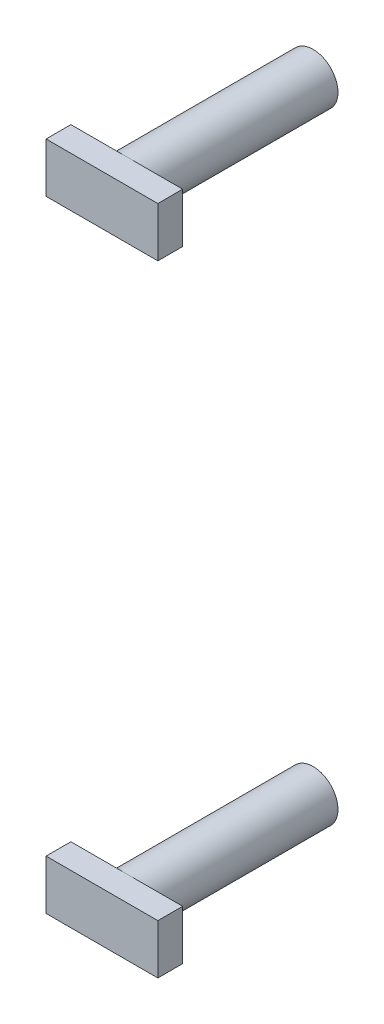
ISO-10303-21;
HEADER;
FILE_DESCRIPTION(('STEP AP214'),'2;1');
FILE_NAME('part.step','',(''),(''),'','','');
FILE_SCHEMA(('AUTOMOTIVE_DESIGN { 1 0 10303 214 1 1 1 1 }'));
ENDSEC;
DATA;
#1=APPLICATION_CONTEXT('core data for automotive mechanical design processes');
#2=APPLICATION_PROTOCOL_DEFINITION('international standard','automotive_design',2000,#1);
#3=PRODUCT_CONTEXT('',#1,'mechanical');
#4=PRODUCT('Part','Part','',(#3));
#5=PRODUCT_RELATED_PRODUCT_CATEGORY('part','',(#4));
#6=PRODUCT_DEFINITION_FORMATION('','',#4);
#7=PRODUCT_DEFINITION_CONTEXT('part definition',#1,'design');
#8=PRODUCT_DEFINITION('design','',#6,#7);
#9=PRODUCT_DEFINITION_SHAPE('','',#8);
#10=(LENGTH_UNIT() NAMED_UNIT(*) SI_UNIT(.MILLI.,.METRE.));
#11=(NAMED_UNIT(*) PLANE_ANGLE_UNIT() SI_UNIT($,.RADIAN.));
#12=(NAMED_UNIT(*) SI_UNIT($,.STERADIAN.) SOLID_ANGLE_UNIT());
#13=UNCERTAINTY_MEASURE_WITH_UNIT(LENGTH_MEASURE(1.E-05),#10,'distance_accuracy_value','');
#14=(GEOMETRIC_REPRESENTATION_CONTEXT(3) GLOBAL_UNCERTAINTY_ASSIGNED_CONTEXT((#13)) GLOBAL_UNIT_ASSIGNED_CONTEXT((#10,
#11,#12)) REPRESENTATION_CONTEXT('',''));
#15=CARTESIAN_POINT('',(0.,0.,0.));
#16=DIRECTION('',(0.,0.,1.));
#17=DIRECTION('',(1.,0.,0.));
#18=AXIS2_PLACEMENT_3D('',#15,#16,#17);
#19=CARTESIAN_POINT('',(19.,25.,-15.));
#20=DIRECTION('',(0.,0.,1.));
#21=DIRECTION('',(1.,0.,0.));
#22=AXIS2_PLACEMENT_3D('',#19,#20,#21);
#23=CYLINDRICAL_SURFACE('',#22,2.00000000000001);
#24=CARTESIAN_POINT('',(19.,25.,-15.));
#25=DIRECTION('',(0.,0.,1.));
#26=DIRECTION('',(1.,0.,0.));
#27=AXIS2_PLACEMENT_3D('',#24,#25,#26);
#28=CIRCLE('',#27,2.00000000000001);
#29=CARTESIAN_POINT('',(21.,25.,-15.));
#30=VERTEX_POINT('',#29);
#31=EDGE_CURVE('E13',#30,#30,#28,.T.);
#32=ORIENTED_EDGE('',*,*,#31,.T.);
#33=EDGE_LOOP('',(#32));
#34=FACE_BOUND('',#33,.T.);
#35=CARTESIAN_POINT('',(19.,25.,0.));
#36=DIRECTION('',(0.,0.,1.));
#37=DIRECTION('',(1.,0.,0.));
#38=AXIS2_PLACEMENT_3D('',#35,#36,#37);
#39=CIRCLE('',#38,2.00000000000001);
#40=CARTESIAN_POINT('',(19.,27.,0.));
#41=VERTEX_POINT('',#40);
#42=CARTESIAN_POINT('',(19.,23.,0.));
#43=VERTEX_POINT('',#42);
#44=EDGE_CURVE('E84',#41,#43,#39,.T.);
#45=ORIENTED_EDGE('',*,*,#44,.F.);
#46=EDGE_CURVE('E94',#43,#41,#39,.T.);
#47=ORIENTED_EDGE('',*,*,#46,.F.);
#48=EDGE_LOOP('',(#45,#47));
#49=FACE_BOUND('',#48,.T.);
#50=ADVANCED_FACE('F81',(#34,#49),#23,.T.);
#51=CARTESIAN_POINT('',(0.,0.,-15.));
#52=DIRECTION('',(0.,0.,1.));
#53=DIRECTION('',(1.,0.,0.));
#54=AXIS2_PLACEMENT_3D('',#51,#52,#53);
#55=PLANE('',#54);
#56=ORIENTED_EDGE('',*,*,#31,.F.);
#57=EDGE_LOOP('',(#56));
#58=FACE_BOUND('',#57,.T.);
#59=ADVANCED_FACE('F187',(#58),#55,.F.);
#60=CARTESIAN_POINT('',(19.,25.,0.));
#61=DIRECTION('',(0.,0.,1.));
#62=DIRECTION('',(1.,0.,0.));
#63=AXIS2_PLACEMENT_3D('',#60,#61,#62);
#64=PLANE('',#63);
#65=DIRECTION('',(1.,0.,0.));
#66=VECTOR('',#65,1.);
#67=CARTESIAN_POINT('',(14.5,27.,0.));
#68=LINE('',#67,#66);
#69=CARTESIAN_POINT('',(14.5,27.,0.));
#70=VERTEX_POINT('',#69);
#71=EDGE_CURVE('E143',#70,#41,#68,.T.);
#72=ORIENTED_EDGE('',*,*,#71,.T.);
#73=ORIENTED_EDGE('',*,*,#44,.T.);
#74=DIRECTION('',(1.,0.,0.));
#75=VECTOR('',#74,1.);
#76=CARTESIAN_POINT('',(14.5,23.,0.));
#77=LINE('',#76,#75);
#78=CARTESIAN_POINT('',(14.5,23.,0.));
#79=VERTEX_POINT('',#78);
#80=EDGE_CURVE('E162',#79,#43,#77,.T.);
#81=ORIENTED_EDGE('',*,*,#80,.F.);
#82=DIRECTION('',(0.,-1.,0.));
#83=VECTOR('',#82,1.);
#84=CARTESIAN_POINT('',(14.5,27.,0.));
#85=LINE('',#84,#83);
#86=EDGE_CURVE('E147',#70,#79,#85,.T.);
#87=ORIENTED_EDGE('',*,*,#86,.F.);
#88=EDGE_LOOP('',(#72,#73,#81,#87));
#89=FACE_BOUND('',#88,.T.);
#90=ADVANCED_FACE('F176',(#89),#64,.F.);
#91=CARTESIAN_POINT('',(23.5,23.,0.));
#92=VERTEX_POINT('',#91);
#93=EDGE_CURVE('E164',#43,#92,#77,.T.);
#94=ORIENTED_EDGE('',*,*,#93,.F.);
#95=ORIENTED_EDGE('',*,*,#46,.T.);
#96=CARTESIAN_POINT('',(23.5,27.,0.));
#97=VERTEX_POINT('',#96);
#98=EDGE_CURVE('E158',#41,#97,#68,.T.);
#99=ORIENTED_EDGE('',*,*,#98,.T.);
#100=DIRECTION('',(0.,-1.,0.));
#101=VECTOR('',#100,1.);
#102=CARTESIAN_POINT('',(23.5,27.,0.));
#103=LINE('',#102,#101);
#104=EDGE_CURVE('E159',#97,#92,#103,.T.);
#105=ORIENTED_EDGE('',*,*,#104,.T.);
#106=EDGE_LOOP('',(#94,#95,#99,#105));
#107=FACE_BOUND('',#106,.T.);
#108=ADVANCED_FACE('F179',(#107),#64,.F.);
#109=CARTESIAN_POINT('',(19.,25.,2.));
#110=DIRECTION('',(0.,0.,1.));
#111=DIRECTION('',(1.,0.,0.));
#112=AXIS2_PLACEMENT_3D('',#109,#110,#111);
#113=PLANE('',#112);
#114=DIRECTION('',(1.,0.,0.));
#115=VECTOR('',#114,1.);
#116=CARTESIAN_POINT('',(14.5,23.,2.));
#117=LINE('',#116,#115);
#118=CARTESIAN_POINT('',(14.5,23.,2.));
#119=VERTEX_POINT('',#118);
#120=CARTESIAN_POINT('',(23.5,23.,2.));
#121=VERTEX_POINT('',#120);
#122=EDGE_CURVE('E123',#119,#121,#117,.T.);
#123=ORIENTED_EDGE('',*,*,#122,.T.);
#124=DIRECTION('',(0.,-1.,0.));
#125=VECTOR('',#124,1.);
#126=CARTESIAN_POINT('',(23.5,27.,2.));
#127=LINE('',#126,#125);
#128=CARTESIAN_POINT('',(23.5,27.,2.));
#129=VERTEX_POINT('',#128);
#130=EDGE_CURVE('E135',#129,#121,#127,.T.);
#131=ORIENTED_EDGE('',*,*,#130,.F.);
#132=DIRECTION('',(1.,0.,0.));
#133=VECTOR('',#132,1.);
#134=CARTESIAN_POINT('',(14.5,27.,2.));
#135=LINE('',#134,#133);
#136=CARTESIAN_POINT('',(14.5,27.,2.));
#137=VERTEX_POINT('',#136);
#138=EDGE_CURVE('E141',#137,#129,#135,.T.);
#139=ORIENTED_EDGE('',*,*,#138,.F.);
#140=DIRECTION('',(0.,-1.,0.));
#141=VECTOR('',#140,1.);
#142=CARTESIAN_POINT('',(14.5,27.,2.));
#143=LINE('',#142,#141);
#144=EDGE_CURVE('E136',#137,#119,#143,.T.);
#145=ORIENTED_EDGE('',*,*,#144,.T.);
#146=EDGE_LOOP('',(#123,#131,#139,#145));
#147=FACE_BOUND('',#146,.T.);
#148=ADVANCED_FACE('F140',(#147),#113,.T.);
#149=CARTESIAN_POINT('',(23.5,27.,2.));
#150=DIRECTION('',(1.,0.,0.));
#151=DIRECTION('',(0.,0.,-1.));
#152=AXIS2_PLACEMENT_3D('',#149,#150,#151);
#153=PLANE('',#152);
#154=ORIENTED_EDGE('',*,*,#104,.F.);
#155=DIRECTION('',(0.,0.,-1.));
#156=VECTOR('',#155,1.);
#157=CARTESIAN_POINT('',(23.5,27.,2.));
#158=LINE('',#157,#156);
#159=EDGE_CURVE('E149',#129,#97,#158,.T.);
#160=ORIENTED_EDGE('',*,*,#159,.F.);
#161=ORIENTED_EDGE('',*,*,#130,.T.);
#162=DIRECTION('',(0.,0.,-1.));
#163=VECTOR('',#162,1.);
#164=CARTESIAN_POINT('',(23.5,23.,2.));
#165=LINE('',#164,#163);
#166=EDGE_CURVE('E131',#121,#92,#165,.T.);
#167=ORIENTED_EDGE('',*,*,#166,.T.);
#168=EDGE_LOOP('',(#154,#160,#161,#167));
#169=FACE_BOUND('',#168,.T.);
#170=ADVANCED_FACE('F170',(#169),#153,.T.);
#171=CARTESIAN_POINT('',(14.5,27.,2.));
#172=DIRECTION('',(0.,1.,0.));
#173=DIRECTION('',(0.,0.,1.));
#174=AXIS2_PLACEMENT_3D('',#171,#172,#173);
#175=PLANE('',#174);
#176=ORIENTED_EDGE('',*,*,#159,.T.);
#177=ORIENTED_EDGE('',*,*,#98,.F.);
#178=ORIENTED_EDGE('',*,*,#71,.F.);
#179=DIRECTION('',(0.,0.,-1.));
#180=VECTOR('',#179,1.);
#181=CARTESIAN_POINT('',(14.5,27.,2.));
#182=LINE('',#181,#180);
#183=EDGE_CURVE('E154',#137,#70,#182,.T.);
#184=ORIENTED_EDGE('',*,*,#183,.F.);
#185=ORIENTED_EDGE('',*,*,#138,.T.);
#186=EDGE_LOOP('',(#176,#177,#178,#184,#185));
#187=FACE_BOUND('',#186,.T.);
#188=ADVANCED_FACE('F173',(#187),#175,.T.);
#189=CARTESIAN_POINT('',(14.5,23.,2.));
#190=DIRECTION('',(0.,1.,0.));
#191=DIRECTION('',(0.,0.,1.));
#192=AXIS2_PLACEMENT_3D('',#189,#190,#191);
#193=PLANE('',#192);
#194=ORIENTED_EDGE('',*,*,#166,.F.);
#195=ORIENTED_EDGE('',*,*,#122,.F.);
#196=DIRECTION('',(0.,0.,-1.));
#197=VECTOR('',#196,1.);
#198=CARTESIAN_POINT('',(14.5,23.,2.));
#199=LINE('',#198,#197);
#200=EDGE_CURVE('E128',#119,#79,#199,.T.);
#201=ORIENTED_EDGE('',*,*,#200,.T.);
#202=ORIENTED_EDGE('',*,*,#80,.T.);
#203=ORIENTED_EDGE('',*,*,#93,.T.);
#204=EDGE_LOOP('',(#194,#195,#201,#202,#203));
#205=FACE_BOUND('',#204,.T.);
#206=ADVANCED_FACE('F125',(#205),#193,.F.);
#207=CARTESIAN_POINT('',(14.5,27.,2.));
#208=DIRECTION('',(1.,0.,0.));
#209=DIRECTION('',(0.,0.,-1.));
#210=AXIS2_PLACEMENT_3D('',#207,#208,#209);
#211=PLANE('',#210);
#212=ORIENTED_EDGE('',*,*,#86,.T.);
#213=ORIENTED_EDGE('',*,*,#200,.F.);
#214=ORIENTED_EDGE('',*,*,#144,.F.);
#215=ORIENTED_EDGE('',*,*,#183,.T.);
#216=EDGE_LOOP('',(#212,#213,#214,#215));
#217=FACE_BOUND('',#216,.T.);
#218=ADVANCED_FACE('F145',(#217),#211,.F.);
#219=CLOSED_SHELL('',(#50,#59,#90,#108,#148,#170,#188,#206,#218));
#220=MANIFOLD_SOLID_BREP('B2',#219);
#221=CARTESIAN_POINT('',(19.,-25.,-15.));
#222=DIRECTION('',(0.,0.,1.));
#223=DIRECTION('',(1.,0.,0.));
#224=AXIS2_PLACEMENT_3D('',#221,#222,#223);
#225=CYLINDRICAL_SURFACE('',#224,2.);
#226=CARTESIAN_POINT('',(19.,-25.,-15.));
#227=DIRECTION('',(0.,0.,1.));
#228=DIRECTION('',(1.,0.,0.));
#229=AXIS2_PLACEMENT_3D('',#226,#227,#228);
#230=CIRCLE('',#229,2.);
#231=CARTESIAN_POINT('',(21.,-25.,-15.));
#232=VERTEX_POINT('',#231);
#233=EDGE_CURVE('E79',#232,#232,#230,.T.);
#234=ORIENTED_EDGE('',*,*,#233,.T.);
#235=EDGE_LOOP('',(#234));
#236=FACE_BOUND('',#235,.T.);
#237=CARTESIAN_POINT('',(19.,-25.,0.));
#238=DIRECTION('',(0.,0.,1.));
#239=DIRECTION('',(1.,0.,0.));
#240=AXIS2_PLACEMENT_3D('',#237,#238,#239);
#241=CIRCLE('',#240,2.);
#242=CARTESIAN_POINT('',(19.,-23.,0.));
#243=VERTEX_POINT('',#242);
#244=CARTESIAN_POINT('',(19.,-27.,0.));
#245=VERTEX_POINT('',#244);
#246=EDGE_CURVE('E286',#243,#245,#241,.T.);
#247=ORIENTED_EDGE('',*,*,#246,.F.);
#248=EDGE_CURVE('E296',#245,#243,#241,.T.);
#249=ORIENTED_EDGE('',*,*,#248,.F.);
#250=EDGE_LOOP('',(#247,#249));
#251=FACE_BOUND('',#250,.T.);
#252=ADVANCED_FACE('F283',(#236,#251),#225,.T.);
#253=CARTESIAN_POINT('',(0.,0.,-15.));
#254=DIRECTION('',(0.,0.,1.));
#255=DIRECTION('',(1.,0.,0.));
#256=AXIS2_PLACEMENT_3D('',#253,#254,#255);
#257=PLANE('',#256);
#258=ORIENTED_EDGE('',*,*,#233,.F.);
#259=EDGE_LOOP('',(#258));
#260=FACE_BOUND('',#259,.T.);
#261=ADVANCED_FACE('F393',(#260),#257,.F.);
#262=CARTESIAN_POINT('',(19.,-25.,0.));
#263=DIRECTION('',(0.,0.,1.));
#264=DIRECTION('',(1.,0.,0.));
#265=AXIS2_PLACEMENT_3D('',#262,#263,#264);
#266=PLANE('',#265);
#267=DIRECTION('',(1.,0.,0.));
#268=VECTOR('',#267,1.);
#269=CARTESIAN_POINT('',(14.5,-23.,0.));
#270=LINE('',#269,#268);
#271=CARTESIAN_POINT('',(14.5,-23.,0.));
#272=VERTEX_POINT('',#271);
#273=EDGE_CURVE('E350',#272,#243,#270,.T.);
#274=ORIENTED_EDGE('',*,*,#273,.T.);
#275=ORIENTED_EDGE('',*,*,#246,.T.);
#276=DIRECTION('',(1.,0.,0.));
#277=VECTOR('',#276,1.);
#278=CARTESIAN_POINT('',(14.5,-27.,0.));
#279=LINE('',#278,#277);
#280=CARTESIAN_POINT('',(14.5,-27.,0.));
#281=VERTEX_POINT('',#280);
#282=EDGE_CURVE('E325',#281,#245,#279,.T.);
#283=ORIENTED_EDGE('',*,*,#282,.F.);
#284=DIRECTION('',(0.,1.,0.));
#285=VECTOR('',#284,1.);
#286=CARTESIAN_POINT('',(14.5,-27.,0.));
#287=LINE('',#286,#285);
#288=EDGE_CURVE('E330',#281,#272,#287,.T.);
#289=ORIENTED_EDGE('',*,*,#288,.T.);
#290=EDGE_LOOP('',(#274,#275,#283,#289));
#291=FACE_BOUND('',#290,.T.);
#292=ADVANCED_FACE('F328',(#291),#266,.F.);
#293=CARTESIAN_POINT('',(23.5,-27.,0.));
#294=VERTEX_POINT('',#293);
#295=EDGE_CURVE('E334',#245,#294,#279,.T.);
#296=ORIENTED_EDGE('',*,*,#295,.F.);
#297=ORIENTED_EDGE('',*,*,#248,.T.);
#298=CARTESIAN_POINT('',(23.5,-23.,0.));
#299=VERTEX_POINT('',#298);
#300=EDGE_CURVE('E352',#243,#299,#270,.T.);
#301=ORIENTED_EDGE('',*,*,#300,.T.);
#302=DIRECTION('',(0.,1.,0.));
#303=VECTOR('',#302,1.);
#304=CARTESIAN_POINT('',(23.5,-27.,0.));
#305=LINE('',#304,#303);
#306=EDGE_CURVE('E333',#294,#299,#305,.T.);
#307=ORIENTED_EDGE('',*,*,#306,.F.);
#308=EDGE_LOOP('',(#296,#297,#301,#307));
#309=FACE_BOUND('',#308,.T.);
#310=ADVANCED_FACE('F372',(#309),#266,.F.);
#311=CARTESIAN_POINT('',(19.,-25.,2.));
#312=DIRECTION('',(0.,0.,1.));
#313=DIRECTION('',(1.,0.,0.));
#314=AXIS2_PLACEMENT_3D('',#311,#312,#313);
#315=PLANE('',#314);
#316=DIRECTION('',(1.,0.,0.));
#317=VECTOR('',#316,1.);
#318=CARTESIAN_POINT('',(14.5,-23.,2.));
#319=LINE('',#318,#317);
#320=CARTESIAN_POINT('',(14.5,-23.,2.));
#321=VERTEX_POINT('',#320);
#322=CARTESIAN_POINT('',(23.5,-23.,2.));
#323=VERTEX_POINT('',#322);
#324=EDGE_CURVE('E360',#321,#323,#319,.T.);
#325=ORIENTED_EDGE('',*,*,#324,.F.);
#326=DIRECTION('',(0.,1.,0.));
#327=VECTOR('',#326,1.);
#328=CARTESIAN_POINT('',(14.5,-27.,2.));
#329=LINE('',#328,#327);
#330=CARTESIAN_POINT('',(14.5,-27.,2.));
#331=VERTEX_POINT('',#330);
#332=EDGE_CURVE('E362',#331,#321,#329,.T.);
#333=ORIENTED_EDGE('',*,*,#332,.F.);
#334=DIRECTION('',(1.,0.,0.));
#335=VECTOR('',#334,1.);
#336=CARTESIAN_POINT('',(14.5,-27.,2.));
#337=LINE('',#336,#335);
#338=CARTESIAN_POINT('',(23.5,-27.,2.));
#339=VERTEX_POINT('',#338);
#340=EDGE_CURVE('E340',#331,#339,#337,.T.);
#341=ORIENTED_EDGE('',*,*,#340,.T.);
#342=DIRECTION('',(0.,1.,0.));
#343=VECTOR('',#342,1.);
#344=CARTESIAN_POINT('',(23.5,-27.,2.));
#345=LINE('',#344,#343);
#346=EDGE_CURVE('E357',#339,#323,#345,.T.);
#347=ORIENTED_EDGE('',*,*,#346,.T.);
#348=EDGE_LOOP('',(#325,#333,#341,#347));
#349=FACE_BOUND('',#348,.T.);
#350=ADVANCED_FACE('F381',(#349),#315,.T.);
#351=CARTESIAN_POINT('',(23.5,-27.,2.));
#352=DIRECTION('',(-1.,0.,0.));
#353=DIRECTION('',(0.,0.,1.));
#354=AXIS2_PLACEMENT_3D('',#351,#352,#353);
#355=PLANE('',#354);
#356=ORIENTED_EDGE('',*,*,#306,.T.);
#357=DIRECTION('',(0.,0.,-1.));
#358=VECTOR('',#357,1.);
#359=CARTESIAN_POINT('',(23.5,-23.,2.));
#360=LINE('',#359,#358);
#361=EDGE_CURVE('E374',#323,#299,#360,.T.);
#362=ORIENTED_EDGE('',*,*,#361,.F.);
#363=ORIENTED_EDGE('',*,*,#346,.F.);
#364=DIRECTION('',(0.,0.,-1.));
#365=VECTOR('',#364,1.);
#366=CARTESIAN_POINT('',(23.5,-27.,2.));
#367=LINE('',#366,#365);
#368=EDGE_CURVE('E344',#339,#294,#367,.T.);
#369=ORIENTED_EDGE('',*,*,#368,.T.);
#370=EDGE_LOOP('',(#356,#362,#363,#369));
#371=FACE_BOUND('',#370,.T.);
#372=ADVANCED_FACE('F379',(#371),#355,.F.);
#373=CARTESIAN_POINT('',(14.5,-23.,2.));
#374=DIRECTION('',(0.,1.,0.));
#375=DIRECTION('',(0.,0.,1.));
#376=AXIS2_PLACEMENT_3D('',#373,#374,#375);
#377=PLANE('',#376);
#378=ORIENTED_EDGE('',*,*,#273,.F.);
#379=DIRECTION('',(0.,0.,-1.));
#380=VECTOR('',#379,1.);
#381=CARTESIAN_POINT('',(14.5,-23.,2.));
#382=LINE('',#381,#380);
#383=EDGE_CURVE('E349',#321,#272,#382,.T.);
#384=ORIENTED_EDGE('',*,*,#383,.F.);
#385=ORIENTED_EDGE('',*,*,#324,.T.);
#386=ORIENTED_EDGE('',*,*,#361,.T.);
#387=ORIENTED_EDGE('',*,*,#300,.F.);
#388=EDGE_LOOP('',(#378,#384,#385,#386,#387));
#389=FACE_BOUND('',#388,.T.);
#390=ADVANCED_FACE('F375',(#389),#377,.T.);
#391=CARTESIAN_POINT('',(14.5,-27.,2.));
#392=DIRECTION('',(0.,1.,0.));
#393=DIRECTION('',(0.,0.,1.));
#394=AXIS2_PLACEMENT_3D('',#391,#392,#393);
#395=PLANE('',#394);
#396=ORIENTED_EDGE('',*,*,#340,.F.);
#397=DIRECTION('',(0.,0.,-1.));
#398=VECTOR('',#397,1.);
#399=CARTESIAN_POINT('',(14.5,-27.,2.));
#400=LINE('',#399,#398);
#401=EDGE_CURVE('E337',#331,#281,#400,.T.);
#402=ORIENTED_EDGE('',*,*,#401,.T.);
#403=ORIENTED_EDGE('',*,*,#282,.T.);
#404=ORIENTED_EDGE('',*,*,#295,.T.);
#405=ORIENTED_EDGE('',*,*,#368,.F.);
#406=EDGE_LOOP('',(#396,#402,#403,#404,#405));
#407=FACE_BOUND('',#406,.T.);
#408=ADVANCED_FACE('F338',(#407),#395,.F.);
#409=CARTESIAN_POINT('',(14.5,-27.,2.));
#410=DIRECTION('',(-1.,0.,0.));
#411=DIRECTION('',(0.,0.,1.));
#412=AXIS2_PLACEMENT_3D('',#409,#410,#411);
#413=PLANE('',#412);
#414=ORIENTED_EDGE('',*,*,#288,.F.);
#415=ORIENTED_EDGE('',*,*,#401,.F.);
#416=ORIENTED_EDGE('',*,*,#332,.T.);
#417=ORIENTED_EDGE('',*,*,#383,.T.);
#418=EDGE_LOOP('',(#414,#415,#416,#417));
#419=FACE_BOUND('',#418,.T.);
#420=ADVANCED_FACE('F347',(#419),#413,.T.);
#421=CLOSED_SHELL('',(#252,#261,#292,#310,#350,#372,#390,#408,#420));
#422=MANIFOLD_SOLID_BREP('B7',#421);
#423=ADVANCED_BREP_SHAPE_REPRESENTATION('',(#18,#220,#422),#14);
#424=SHAPE_DEFINITION_REPRESENTATION(#9,#423);
ENDSEC;
END-ISO-10303-21;
